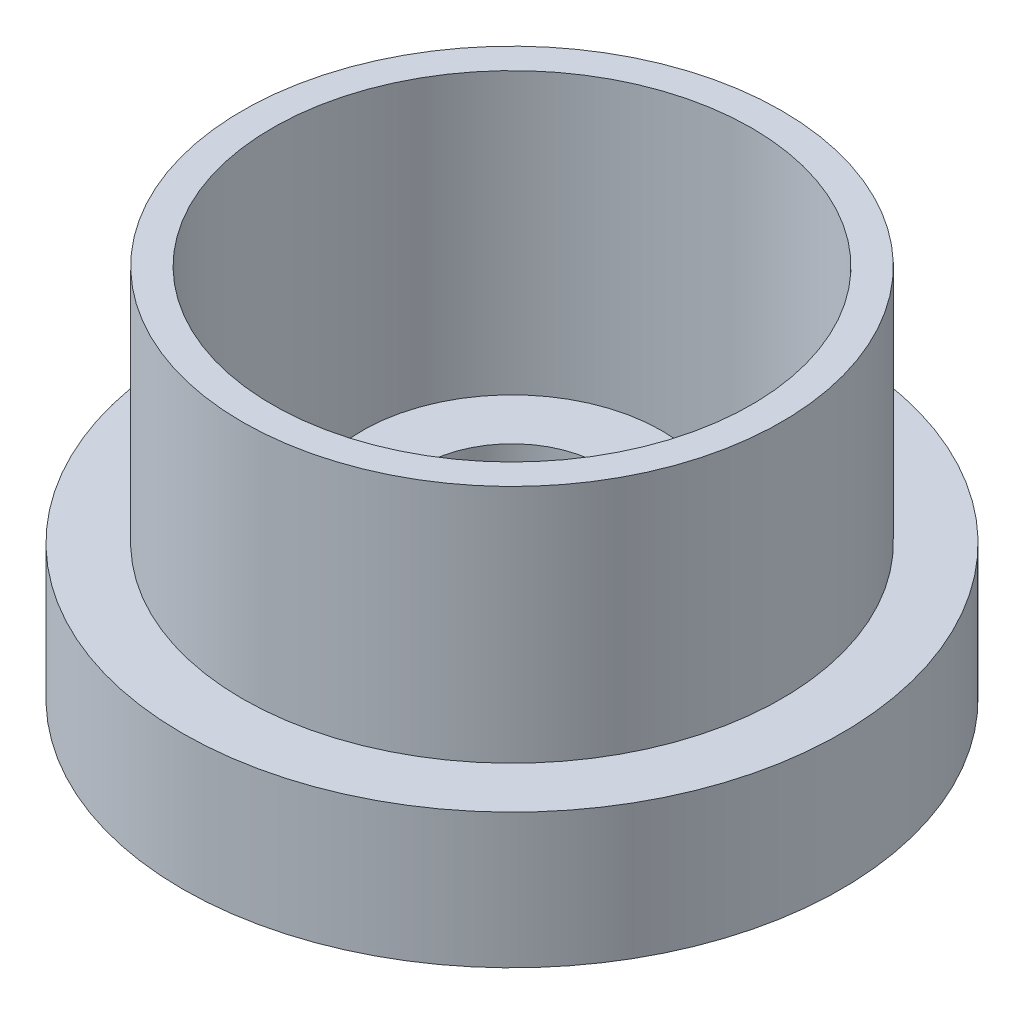
ISO-10303-21;
HEADER;
FILE_DESCRIPTION(('STEP AP214'),'2;1');
FILE_NAME('part.step','',(''),(''),'','','');
FILE_SCHEMA(('AUTOMOTIVE_DESIGN { 1 0 10303 214 1 1 1 1 }'));
ENDSEC;
DATA;
#1=APPLICATION_CONTEXT('core data for automotive mechanical design processes');
#2=APPLICATION_PROTOCOL_DEFINITION('international standard','automotive_design',2000,#1);
#3=PRODUCT_CONTEXT('',#1,'mechanical');
#4=PRODUCT('Part','Part','',(#3));
#5=PRODUCT_RELATED_PRODUCT_CATEGORY('part','',(#4));
#6=PRODUCT_DEFINITION_FORMATION('','',#4);
#7=PRODUCT_DEFINITION_CONTEXT('part definition',#1,'design');
#8=PRODUCT_DEFINITION('design','',#6,#7);
#9=PRODUCT_DEFINITION_SHAPE('','',#8);
#10=(LENGTH_UNIT() NAMED_UNIT(*) SI_UNIT(.MILLI.,.METRE.));
#11=(NAMED_UNIT(*) PLANE_ANGLE_UNIT() SI_UNIT($,.RADIAN.));
#12=(NAMED_UNIT(*) SI_UNIT($,.STERADIAN.) SOLID_ANGLE_UNIT());
#13=UNCERTAINTY_MEASURE_WITH_UNIT(LENGTH_MEASURE(1.E-05),#10,'distance_accuracy_value','');
#14=(GEOMETRIC_REPRESENTATION_CONTEXT(3) GLOBAL_UNCERTAINTY_ASSIGNED_CONTEXT((#13)) GLOBAL_UNIT_ASSIGNED_CONTEXT((#10,
#11,#12)) REPRESENTATION_CONTEXT('',''));
#15=CARTESIAN_POINT('',(0.,0.,0.));
#16=DIRECTION('',(0.,0.,1.));
#17=DIRECTION('',(1.,0.,0.));
#18=AXIS2_PLACEMENT_3D('',#15,#16,#17);
#19=CARTESIAN_POINT('',(-22.,0.,0.));
#20=DIRECTION('',(0.,1.,0.));
#21=DIRECTION('',(0.,0.,1.));
#22=AXIS2_PLACEMENT_3D('',#19,#20,#21);
#23=PLANE('',#22);
#24=CARTESIAN_POINT('',(0.,0.,0.));
#25=DIRECTION('',(0.,-1.,0.));
#26=DIRECTION('',(0.,0.,-1.));
#27=AXIS2_PLACEMENT_3D('',#24,#25,#26);
#28=CIRCLE('',#27,6.);
#29=CARTESIAN_POINT('',(0.,0.,-6.));
#30=VERTEX_POINT('',#29);
#31=EDGE_CURVE('E10',#30,#30,#28,.T.);
#32=ORIENTED_EDGE('',*,*,#31,.F.);
#33=EDGE_LOOP('',(#32));
#34=FACE_BOUND('',#33,.T.);
#35=CARTESIAN_POINT('',(0.,0.,0.));
#36=DIRECTION('',(0.,-1.,0.));
#37=DIRECTION('',(0.,0.,-1.));
#38=AXIS2_PLACEMENT_3D('',#35,#36,#37);
#39=CIRCLE('',#38,22.);
#40=CARTESIAN_POINT('',(0.,0.,-22.));
#41=VERTEX_POINT('',#40);
#42=EDGE_CURVE('E65',#41,#41,#39,.T.);
#43=ORIENTED_EDGE('',*,*,#42,.T.);
#44=EDGE_LOOP('',(#43));
#45=FACE_BOUND('',#44,.T.);
#46=ADVANCED_FACE('F31',(#34,#45),#23,.F.);
#47=CARTESIAN_POINT('',(0.,-75.1045135406219,0.));
#48=DIRECTION('',(0.,-1.,0.));
#49=DIRECTION('',(0.,0.,-1.));
#50=AXIS2_PLACEMENT_3D('',#47,#48,#49);
#51=CYLINDRICAL_SURFACE('',#50,6.);
#52=CARTESIAN_POINT('',(0.,10.5,0.));
#53=DIRECTION('',(0.,-1.,0.));
#54=DIRECTION('',(0.,0.,-1.));
#55=AXIS2_PLACEMENT_3D('',#52,#53,#54);
#56=CIRCLE('',#55,6.);
#57=CARTESIAN_POINT('',(0.,10.5,-6.));
#58=VERTEX_POINT('',#57);
#59=EDGE_CURVE('E37',#58,#58,#56,.T.);
#60=ORIENTED_EDGE('',*,*,#59,.F.);
#61=EDGE_LOOP('',(#60));
#62=FACE_BOUND('',#61,.T.);
#63=ORIENTED_EDGE('',*,*,#31,.T.);
#64=EDGE_LOOP('',(#63));
#65=FACE_BOUND('',#64,.T.);
#66=ADVANCED_FACE('F116',(#62,#65),#51,.F.);
#67=CARTESIAN_POINT('',(-6.,10.5,0.));
#68=DIRECTION('',(0.,-1.,0.));
#69=DIRECTION('',(0.,0.,-1.));
#70=AXIS2_PLACEMENT_3D('',#67,#68,#69);
#71=PLANE('',#70);
#72=CARTESIAN_POINT('',(0.,10.5,0.));
#73=DIRECTION('',(0.,-1.,0.));
#74=DIRECTION('',(0.,0.,-1.));
#75=AXIS2_PLACEMENT_3D('',#72,#73,#74);
#76=CIRCLE('',#75,10.);
#77=CARTESIAN_POINT('',(0.,10.5,-10.));
#78=VERTEX_POINT('',#77);
#79=EDGE_CURVE('E41',#78,#78,#76,.T.);
#80=ORIENTED_EDGE('',*,*,#79,.F.);
#81=EDGE_LOOP('',(#80));
#82=FACE_BOUND('',#81,.T.);
#83=ORIENTED_EDGE('',*,*,#59,.T.);
#84=EDGE_LOOP('',(#83));
#85=FACE_BOUND('',#84,.T.);
#86=ADVANCED_FACE('F111',(#82,#85),#71,.F.);
#87=CARTESIAN_POINT('',(0.,-75.1045135406219,0.));
#88=DIRECTION('',(0.,-1.,0.));
#89=DIRECTION('',(0.,0.,-1.));
#90=AXIS2_PLACEMENT_3D('',#87,#88,#89);
#91=CYLINDRICAL_SURFACE('',#90,10.);
#92=CARTESIAN_POINT('',(0.,5.,0.));
#93=DIRECTION('',(0.,-1.,0.));
#94=DIRECTION('',(0.,0.,-1.));
#95=AXIS2_PLACEMENT_3D('',#92,#93,#94);
#96=CIRCLE('',#95,10.);
#97=CARTESIAN_POINT('',(0.,5.,-10.));
#98=VERTEX_POINT('',#97);
#99=EDGE_CURVE('E45',#98,#98,#96,.T.);
#100=ORIENTED_EDGE('',*,*,#99,.F.);
#101=EDGE_LOOP('',(#100));
#102=FACE_BOUND('',#101,.T.);
#103=ORIENTED_EDGE('',*,*,#79,.T.);
#104=EDGE_LOOP('',(#103));
#105=FACE_BOUND('',#104,.T.);
#106=ADVANCED_FACE('F105',(#102,#105),#91,.T.);
#107=CARTESIAN_POINT('',(-10.,5.,0.));
#108=DIRECTION('',(0.,-1.,0.));
#109=DIRECTION('',(0.,0.,-1.));
#110=AXIS2_PLACEMENT_3D('',#107,#108,#109);
#111=PLANE('',#110);
#112=CARTESIAN_POINT('',(0.,5.,0.));
#113=DIRECTION('',(0.,-1.,0.));
#114=DIRECTION('',(0.,0.,-1.));
#115=AXIS2_PLACEMENT_3D('',#112,#113,#114);
#116=CIRCLE('',#115,16.);
#117=CARTESIAN_POINT('',(0.,5.,-16.));
#118=VERTEX_POINT('',#117);
#119=EDGE_CURVE('E50',#118,#118,#116,.T.);
#120=ORIENTED_EDGE('',*,*,#119,.F.);
#121=EDGE_LOOP('',(#120));
#122=FACE_BOUND('',#121,.T.);
#123=ORIENTED_EDGE('',*,*,#99,.T.);
#124=EDGE_LOOP('',(#123));
#125=FACE_BOUND('',#124,.T.);
#126=ADVANCED_FACE('F99',(#122,#125),#111,.F.);
#127=CARTESIAN_POINT('',(0.,-75.1045135406219,0.));
#128=DIRECTION('',(0.,-1.,0.));
#129=DIRECTION('',(0.,0.,-1.));
#130=AXIS2_PLACEMENT_3D('',#127,#128,#129);
#131=CYLINDRICAL_SURFACE('',#130,16.);
#132=CARTESIAN_POINT('',(0.,25.,0.));
#133=DIRECTION('',(0.,-1.,0.));
#134=DIRECTION('',(0.,0.,-1.));
#135=AXIS2_PLACEMENT_3D('',#132,#133,#134);
#136=CIRCLE('',#135,16.);
#137=CARTESIAN_POINT('',(0.,25.,-16.));
#138=VERTEX_POINT('',#137);
#139=EDGE_CURVE('E53',#138,#138,#136,.T.);
#140=ORIENTED_EDGE('',*,*,#139,.F.);
#141=EDGE_LOOP('',(#140));
#142=FACE_BOUND('',#141,.T.);
#143=ORIENTED_EDGE('',*,*,#119,.T.);
#144=EDGE_LOOP('',(#143));
#145=FACE_BOUND('',#144,.T.);
#146=ADVANCED_FACE('F93',(#142,#145),#131,.F.);
#147=CARTESIAN_POINT('',(-16.,25.,0.));
#148=DIRECTION('',(0.,-1.,0.));
#149=DIRECTION('',(0.,0.,-1.));
#150=AXIS2_PLACEMENT_3D('',#147,#148,#149);
#151=PLANE('',#150);
#152=CARTESIAN_POINT('',(0.,25.,0.));
#153=DIRECTION('',(0.,-1.,0.));
#154=DIRECTION('',(0.,0.,-1.));
#155=AXIS2_PLACEMENT_3D('',#152,#153,#154);
#156=CIRCLE('',#155,18.);
#157=CARTESIAN_POINT('',(0.,25.,-18.));
#158=VERTEX_POINT('',#157);
#159=EDGE_CURVE('E56',#158,#158,#156,.T.);
#160=ORIENTED_EDGE('',*,*,#159,.F.);
#161=EDGE_LOOP('',(#160));
#162=FACE_BOUND('',#161,.T.);
#163=ORIENTED_EDGE('',*,*,#139,.T.);
#164=EDGE_LOOP('',(#163));
#165=FACE_BOUND('',#164,.T.);
#166=ADVANCED_FACE('F87',(#162,#165),#151,.F.);
#167=CARTESIAN_POINT('',(0.,-75.1045135406219,0.));
#168=DIRECTION('',(0.,-1.,0.));
#169=DIRECTION('',(0.,0.,-1.));
#170=AXIS2_PLACEMENT_3D('',#167,#168,#169);
#171=CYLINDRICAL_SURFACE('',#170,18.);
#172=CARTESIAN_POINT('',(0.,8.99999999999999,0.));
#173=DIRECTION('',(0.,-1.,0.));
#174=DIRECTION('',(0.,0.,-1.));
#175=AXIS2_PLACEMENT_3D('',#172,#173,#174);
#176=CIRCLE('',#175,18.);
#177=CARTESIAN_POINT('',(0.,8.99999999999999,-18.));
#178=VERTEX_POINT('',#177);
#179=EDGE_CURVE('E59',#178,#178,#176,.T.);
#180=ORIENTED_EDGE('',*,*,#179,.F.);
#181=EDGE_LOOP('',(#180));
#182=FACE_BOUND('',#181,.T.);
#183=ORIENTED_EDGE('',*,*,#159,.T.);
#184=EDGE_LOOP('',(#183));
#185=FACE_BOUND('',#184,.T.);
#186=ADVANCED_FACE('F81',(#182,#185),#171,.T.);
#187=CARTESIAN_POINT('',(-18.,9.,0.));
#188=DIRECTION('',(0.,-1.,0.));
#189=DIRECTION('',(0.,0.,-1.));
#190=AXIS2_PLACEMENT_3D('',#187,#188,#189);
#191=PLANE('',#190);
#192=CARTESIAN_POINT('',(0.,8.99999999999999,0.));
#193=DIRECTION('',(0.,-1.,0.));
#194=DIRECTION('',(0.,0.,-1.));
#195=AXIS2_PLACEMENT_3D('',#192,#193,#194);
#196=CIRCLE('',#195,22.);
#197=CARTESIAN_POINT('',(0.,8.99999999999999,-22.));
#198=VERTEX_POINT('',#197);
#199=EDGE_CURVE('E62',#198,#198,#196,.T.);
#200=ORIENTED_EDGE('',*,*,#199,.F.);
#201=EDGE_LOOP('',(#200));
#202=FACE_BOUND('',#201,.T.);
#203=ORIENTED_EDGE('',*,*,#179,.T.);
#204=EDGE_LOOP('',(#203));
#205=FACE_BOUND('',#204,.T.);
#206=ADVANCED_FACE('F75',(#202,#205),#191,.F.);
#207=CARTESIAN_POINT('',(0.,-75.1045135406219,0.));
#208=DIRECTION('',(0.,-1.,0.));
#209=DIRECTION('',(0.,0.,-1.));
#210=AXIS2_PLACEMENT_3D('',#207,#208,#209);
#211=CYLINDRICAL_SURFACE('',#210,22.);
#212=ORIENTED_EDGE('',*,*,#42,.F.);
#213=EDGE_LOOP('',(#212));
#214=FACE_BOUND('',#213,.T.);
#215=ORIENTED_EDGE('',*,*,#199,.T.);
#216=EDGE_LOOP('',(#215));
#217=FACE_BOUND('',#216,.T.);
#218=ADVANCED_FACE('F72',(#214,#217),#211,.T.);
#219=CLOSED_SHELL('',(#46,#66,#86,#106,#126,#146,#166,#186,#206,#218));
#220=MANIFOLD_SOLID_BREP('B2',#219);
#221=ADVANCED_BREP_SHAPE_REPRESENTATION('',(#18,#220),#14);
#222=SHAPE_DEFINITION_REPRESENTATION(#9,#221);
ENDSEC;
END-ISO-10303-21;
